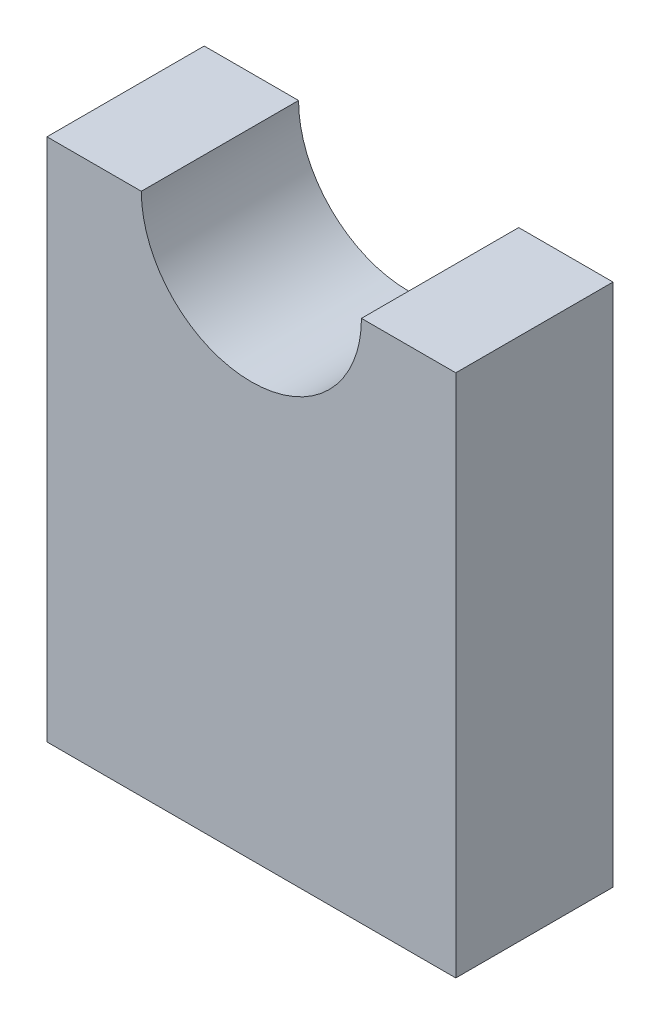
ISO-10303-21;
HEADER;
FILE_DESCRIPTION(('STEP AP214'),'2;1');
FILE_NAME('part.step','',(''),(''),'','','');
FILE_SCHEMA(('AUTOMOTIVE_DESIGN { 1 0 10303 214 1 1 1 1 }'));
ENDSEC;
DATA;
#1=APPLICATION_CONTEXT('core data for automotive mechanical design processes');
#2=APPLICATION_PROTOCOL_DEFINITION('international standard','automotive_design',2000,#1);
#3=PRODUCT_CONTEXT('',#1,'mechanical');
#4=PRODUCT('Part','Part','',(#3));
#5=PRODUCT_RELATED_PRODUCT_CATEGORY('part','',(#4));
#6=PRODUCT_DEFINITION_FORMATION('','',#4);
#7=PRODUCT_DEFINITION_CONTEXT('part definition',#1,'design');
#8=PRODUCT_DEFINITION('design','',#6,#7);
#9=PRODUCT_DEFINITION_SHAPE('','',#8);
#10=(LENGTH_UNIT() NAMED_UNIT(*) SI_UNIT(.MILLI.,.METRE.));
#11=(NAMED_UNIT(*) PLANE_ANGLE_UNIT() SI_UNIT($,.RADIAN.));
#12=(NAMED_UNIT(*) SI_UNIT($,.STERADIAN.) SOLID_ANGLE_UNIT());
#13=UNCERTAINTY_MEASURE_WITH_UNIT(LENGTH_MEASURE(1.E-05),#10,'distance_accuracy_value','');
#14=(GEOMETRIC_REPRESENTATION_CONTEXT(3) GLOBAL_UNCERTAINTY_ASSIGNED_CONTEXT((#13)) GLOBAL_UNIT_ASSIGNED_CONTEXT((#10,
#11,#12)) REPRESENTATION_CONTEXT('',''));
#15=CARTESIAN_POINT('',(0.,0.,0.));
#16=DIRECTION('',(0.,0.,1.));
#17=DIRECTION('',(1.,0.,0.));
#18=AXIS2_PLACEMENT_3D('',#15,#16,#17);
#19=CARTESIAN_POINT('',(0.,100.,0.));
#20=DIRECTION('',(0.,1.,0.));
#21=DIRECTION('',(0.,0.,1.));
#22=AXIS2_PLACEMENT_3D('',#19,#20,#21);
#23=PLANE('',#22);
#24=DIRECTION('',(0.,0.,1.));
#25=VECTOR('',#24,1.);
#26=CARTESIAN_POINT('',(-21.,100.,-15.));
#27=LINE('',#26,#25);
#28=CARTESIAN_POINT('',(-21.,100.,-15.));
#29=VERTEX_POINT('',#28);
#30=CARTESIAN_POINT('',(-21.,100.,15.));
#31=VERTEX_POINT('',#30);
#32=EDGE_CURVE('E11',#29,#31,#27,.T.);
#33=ORIENTED_EDGE('',*,*,#32,.F.);
#34=DIRECTION('',(-1.,0.,0.));
#35=VECTOR('',#34,1.);
#36=CARTESIAN_POINT('',(-39.,100.,-15.));
#37=LINE('',#36,#35);
#38=CARTESIAN_POINT('',(-39.,100.,-15.));
#39=VERTEX_POINT('',#38);
#40=EDGE_CURVE('E137',#29,#39,#37,.T.);
#41=ORIENTED_EDGE('',*,*,#40,.T.);
#42=DIRECTION('',(0.,0.,1.));
#43=VECTOR('',#42,1.);
#44=CARTESIAN_POINT('',(-39.,100.,-15.));
#45=LINE('',#44,#43);
#46=CARTESIAN_POINT('',(-39.,100.,15.));
#47=VERTEX_POINT('',#46);
#48=EDGE_CURVE('E112',#39,#47,#45,.T.);
#49=ORIENTED_EDGE('',*,*,#48,.T.);
#50=DIRECTION('',(1.,0.,0.));
#51=VECTOR('',#50,1.);
#52=CARTESIAN_POINT('',(-39.,100.,15.));
#53=LINE('',#52,#51);
#54=EDGE_CURVE('E109',#47,#31,#53,.T.);
#55=ORIENTED_EDGE('',*,*,#54,.T.);
#56=EDGE_LOOP('',(#33,#41,#49,#55));
#57=FACE_BOUND('',#56,.T.);
#58=ADVANCED_FACE('F41',(#57),#23,.T.);
#59=CARTESIAN_POINT('',(39.,100.,-15.));
#60=DIRECTION('',(-1.,0.,0.));
#61=DIRECTION('',(0.,0.,1.));
#62=AXIS2_PLACEMENT_3D('',#59,#60,#61);
#63=PLANE('',#62);
#64=DIRECTION('',(0.,0.,-1.));
#65=VECTOR('',#64,1.);
#66=CARTESIAN_POINT('',(39.,0.,-15.));
#67=LINE('',#66,#65);
#68=CARTESIAN_POINT('',(39.,0.,15.));
#69=VERTEX_POINT('',#68);
#70=CARTESIAN_POINT('',(39.,0.,-15.));
#71=VERTEX_POINT('',#70);
#72=EDGE_CURVE('E121',#69,#71,#67,.T.);
#73=ORIENTED_EDGE('',*,*,#72,.T.);
#74=DIRECTION('',(0.,-1.,0.));
#75=VECTOR('',#74,1.);
#76=CARTESIAN_POINT('',(39.,100.,-15.));
#77=LINE('',#76,#75);
#78=CARTESIAN_POINT('',(39.,100.,-15.));
#79=VERTEX_POINT('',#78);
#80=EDGE_CURVE('E134',#79,#71,#77,.T.);
#81=ORIENTED_EDGE('',*,*,#80,.F.);
#82=DIRECTION('',(0.,0.,-1.));
#83=VECTOR('',#82,1.);
#84=CARTESIAN_POINT('',(39.,100.,-15.));
#85=LINE('',#84,#83);
#86=CARTESIAN_POINT('',(39.,100.,15.));
#87=VERTEX_POINT('',#86);
#88=EDGE_CURVE('E128',#87,#79,#85,.T.);
#89=ORIENTED_EDGE('',*,*,#88,.F.);
#90=DIRECTION('',(0.,-1.,0.));
#91=VECTOR('',#90,1.);
#92=CARTESIAN_POINT('',(39.,100.,15.));
#93=LINE('',#92,#91);
#94=EDGE_CURVE('E114',#87,#69,#93,.T.);
#95=ORIENTED_EDGE('',*,*,#94,.T.);
#96=EDGE_LOOP('',(#73,#81,#89,#95));
#97=FACE_BOUND('',#96,.T.);
#98=ADVANCED_FACE('F43',(#97),#63,.F.);
#99=CARTESIAN_POINT('',(-39.,100.,-15.));
#100=DIRECTION('',(0.,0.,1.));
#101=DIRECTION('',(1.,0.,0.));
#102=AXIS2_PLACEMENT_3D('',#99,#100,#101);
#103=PLANE('',#102);
#104=ORIENTED_EDGE('',*,*,#40,.F.);
#105=CARTESIAN_POINT('',(0.,100.,-15.));
#106=DIRECTION('',(0.,0.,1.));
#107=DIRECTION('',(1.,0.,0.));
#108=AXIS2_PLACEMENT_3D('',#105,#106,#107);
#109=CIRCLE('',#108,21.);
#110=CARTESIAN_POINT('',(21.,100.,-15.));
#111=VERTEX_POINT('',#110);
#112=EDGE_CURVE('E103',#29,#111,#109,.T.);
#113=ORIENTED_EDGE('',*,*,#112,.T.);
#114=EDGE_CURVE('E93',#79,#111,#37,.T.);
#115=ORIENTED_EDGE('',*,*,#114,.F.);
#116=ORIENTED_EDGE('',*,*,#80,.T.);
#117=DIRECTION('',(-1.,0.,0.));
#118=VECTOR('',#117,1.);
#119=CARTESIAN_POINT('',(-39.,0.,-15.));
#120=LINE('',#119,#118);
#121=CARTESIAN_POINT('',(-39.,0.,-15.));
#122=VERTEX_POINT('',#121);
#123=EDGE_CURVE('E124',#71,#122,#120,.T.);
#124=ORIENTED_EDGE('',*,*,#123,.T.);
#125=DIRECTION('',(0.,-1.,0.));
#126=VECTOR('',#125,1.);
#127=CARTESIAN_POINT('',(-39.,100.,-15.));
#128=LINE('',#127,#126);
#129=EDGE_CURVE('E131',#39,#122,#128,.T.);
#130=ORIENTED_EDGE('',*,*,#129,.F.);
#131=EDGE_LOOP('',(#104,#113,#115,#116,#124,#130));
#132=FACE_BOUND('',#131,.T.);
#133=ADVANCED_FACE('F135',(#132),#103,.F.);
#134=CARTESIAN_POINT('',(-39.,100.,-15.));
#135=DIRECTION('',(1.,0.,0.));
#136=DIRECTION('',(0.,0.,-1.));
#137=AXIS2_PLACEMENT_3D('',#134,#135,#136);
#138=PLANE('',#137);
#139=DIRECTION('',(0.,0.,1.));
#140=VECTOR('',#139,1.);
#141=CARTESIAN_POINT('',(-39.,0.,-15.));
#142=LINE('',#141,#140);
#143=CARTESIAN_POINT('',(-39.,0.,15.));
#144=VERTEX_POINT('',#143);
#145=EDGE_CURVE('E126',#122,#144,#142,.T.);
#146=ORIENTED_EDGE('',*,*,#145,.T.);
#147=DIRECTION('',(0.,-1.,0.));
#148=VECTOR('',#147,1.);
#149=CARTESIAN_POINT('',(-39.,100.,15.));
#150=LINE('',#149,#148);
#151=EDGE_CURVE('E116',#47,#144,#150,.T.);
#152=ORIENTED_EDGE('',*,*,#151,.F.);
#153=ORIENTED_EDGE('',*,*,#48,.F.);
#154=ORIENTED_EDGE('',*,*,#129,.T.);
#155=EDGE_LOOP('',(#146,#152,#153,#154));
#156=FACE_BOUND('',#155,.T.);
#157=ADVANCED_FACE('F145',(#156),#138,.F.);
#158=CARTESIAN_POINT('',(-39.,100.,15.));
#159=DIRECTION('',(0.,0.,-1.));
#160=DIRECTION('',(-1.,0.,0.));
#161=AXIS2_PLACEMENT_3D('',#158,#159,#160);
#162=PLANE('',#161);
#163=CARTESIAN_POINT('',(21.,100.,15.));
#164=VERTEX_POINT('',#163);
#165=EDGE_CURVE('E63',#164,#87,#53,.T.);
#166=ORIENTED_EDGE('',*,*,#165,.F.);
#167=CARTESIAN_POINT('',(0.,100.,15.));
#168=DIRECTION('',(0.,0.,1.));
#169=DIRECTION('',(1.,0.,0.));
#170=AXIS2_PLACEMENT_3D('',#167,#168,#169);
#171=CIRCLE('',#170,21.);
#172=EDGE_CURVE('E55',#31,#164,#171,.T.);
#173=ORIENTED_EDGE('',*,*,#172,.F.);
#174=ORIENTED_EDGE('',*,*,#54,.F.);
#175=ORIENTED_EDGE('',*,*,#151,.T.);
#176=DIRECTION('',(1.,0.,0.));
#177=VECTOR('',#176,1.);
#178=CARTESIAN_POINT('',(-39.,0.,15.));
#179=LINE('',#178,#177);
#180=EDGE_CURVE('E85',#144,#69,#179,.T.);
#181=ORIENTED_EDGE('',*,*,#180,.T.);
#182=ORIENTED_EDGE('',*,*,#94,.F.);
#183=EDGE_LOOP('',(#166,#173,#174,#175,#181,#182));
#184=FACE_BOUND('',#183,.T.);
#185=ADVANCED_FACE('F108',(#184),#162,.F.);
#186=DIRECTION('',(0.,0.,1.));
#187=VECTOR('',#186,1.);
#188=CARTESIAN_POINT('',(21.,100.,-15.));
#189=LINE('',#188,#187);
#190=EDGE_CURVE('E49',#164,#111,#189,.F.);
#191=ORIENTED_EDGE('',*,*,#190,.F.);
#192=ORIENTED_EDGE('',*,*,#165,.T.);
#193=ORIENTED_EDGE('',*,*,#88,.T.);
#194=ORIENTED_EDGE('',*,*,#114,.T.);
#195=EDGE_LOOP('',(#191,#192,#193,#194));
#196=FACE_BOUND('',#195,.T.);
#197=ADVANCED_FACE('F139',(#196),#23,.T.);
#198=CARTESIAN_POINT('',(0.,0.,0.));
#199=DIRECTION('',(0.,1.,0.));
#200=DIRECTION('',(0.,0.,1.));
#201=AXIS2_PLACEMENT_3D('',#198,#199,#200);
#202=PLANE('',#201);
#203=ORIENTED_EDGE('',*,*,#72,.F.);
#204=ORIENTED_EDGE('',*,*,#180,.F.);
#205=ORIENTED_EDGE('',*,*,#145,.F.);
#206=ORIENTED_EDGE('',*,*,#123,.F.);
#207=EDGE_LOOP('',(#203,#204,#205,#206));
#208=FACE_BOUND('',#207,.T.);
#209=ADVANCED_FACE('F148',(#208),#202,.F.);
#210=CARTESIAN_POINT('',(0.,100.,-15.));
#211=DIRECTION('',(0.,0.,1.));
#212=DIRECTION('',(1.,0.,0.));
#213=AXIS2_PLACEMENT_3D('',#210,#211,#212);
#214=CYLINDRICAL_SURFACE('',#213,21.);
#215=ORIENTED_EDGE('',*,*,#32,.T.);
#216=ORIENTED_EDGE('',*,*,#172,.T.);
#217=ORIENTED_EDGE('',*,*,#190,.T.);
#218=ORIENTED_EDGE('',*,*,#112,.F.);
#219=EDGE_LOOP('',(#215,#216,#217,#218));
#220=FACE_BOUND('',#219,.T.);
#221=ADVANCED_FACE('F102',(#220),#214,.F.);
#222=CLOSED_SHELL('',(#58,#98,#133,#157,#185,#197,#209,#221));
#223=MANIFOLD_SOLID_BREP('B2',#222);
#224=ADVANCED_BREP_SHAPE_REPRESENTATION('',(#18,#223),#14);
#225=SHAPE_DEFINITION_REPRESENTATION(#9,#224);
ENDSEC;
END-ISO-10303-21;
